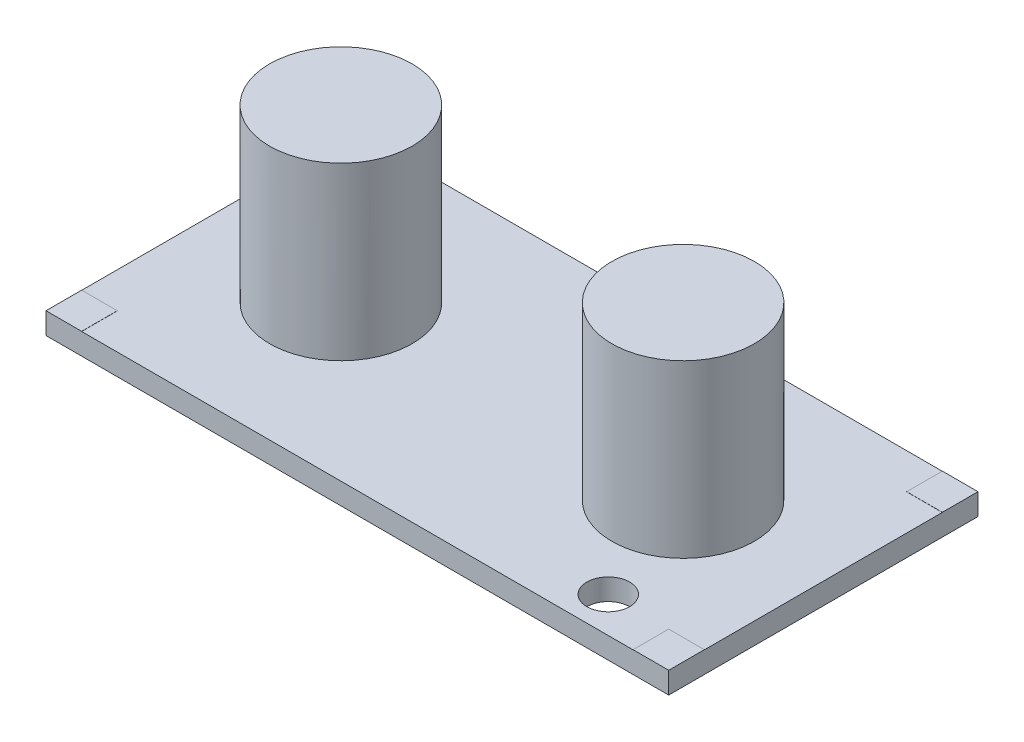
ISO-10303-21;
HEADER;
FILE_DESCRIPTION(('STEP AP214'),'2;1');
FILE_NAME('part.step','',(''),(''),'','','');
FILE_SCHEMA(('AUTOMOTIVE_DESIGN { 1 0 10303 214 1 1 1 1 }'));
ENDSEC;
DATA;
#1=APPLICATION_CONTEXT('core data for automotive mechanical design processes');
#2=APPLICATION_PROTOCOL_DEFINITION('international standard','automotive_design',2000,#1);
#3=PRODUCT_CONTEXT('',#1,'mechanical');
#4=PRODUCT('Part','Part','',(#3));
#5=PRODUCT_RELATED_PRODUCT_CATEGORY('part','',(#4));
#6=PRODUCT_DEFINITION_FORMATION('','',#4);
#7=PRODUCT_DEFINITION_CONTEXT('part definition',#1,'design');
#8=PRODUCT_DEFINITION('design','',#6,#7);
#9=PRODUCT_DEFINITION_SHAPE('','',#8);
#10=(LENGTH_UNIT() NAMED_UNIT(*) SI_UNIT(.MILLI.,.METRE.));
#11=(NAMED_UNIT(*) PLANE_ANGLE_UNIT() SI_UNIT($,.RADIAN.));
#12=(NAMED_UNIT(*) SI_UNIT($,.STERADIAN.) SOLID_ANGLE_UNIT());
#13=UNCERTAINTY_MEASURE_WITH_UNIT(LENGTH_MEASURE(1.E-05),#10,'distance_accuracy_value','');
#14=(GEOMETRIC_REPRESENTATION_CONTEXT(3) GLOBAL_UNCERTAINTY_ASSIGNED_CONTEXT((#13)) GLOBAL_UNIT_ASSIGNED_CONTEXT((#10,
#11,#12)) REPRESENTATION_CONTEXT('',''));
#15=CARTESIAN_POINT('',(0.,0.,0.));
#16=DIRECTION('',(0.,0.,1.));
#17=DIRECTION('',(1.,0.,0.));
#18=AXIS2_PLACEMENT_3D('',#15,#16,#17);
#19=CARTESIAN_POINT('',(0.,1.5,0.));
#20=DIRECTION('',(0.,-1.,0.));
#21=DIRECTION('',(0.,0.,-1.));
#22=AXIS2_PLACEMENT_3D('',#19,#20,#21);
#23=PLANE('',#22);
#24=CARTESIAN_POINT('',(12.,1.5,0.));
#25=DIRECTION('',(0.,-1.,0.));
#26=DIRECTION('',(0.,0.,-1.));
#27=AXIS2_PLACEMENT_3D('',#24,#25,#26);
#28=CIRCLE('',#27,5.);
#29=CARTESIAN_POINT('',(12.,1.5,-5.));
#30=VERTEX_POINT('',#29);
#31=EDGE_CURVE('E11',#30,#30,#28,.F.);
#32=ORIENTED_EDGE('',*,*,#31,.F.);
#33=EDGE_LOOP('',(#32));
#34=FACE_BOUND('',#33,.T.);
#35=CARTESIAN_POINT('',(-12.,1.5,0.));
#36=DIRECTION('',(0.,-1.,0.));
#37=DIRECTION('',(0.,0.,-1.));
#38=AXIS2_PLACEMENT_3D('',#35,#36,#37);
#39=CIRCLE('',#38,5.);
#40=CARTESIAN_POINT('',(-12.,1.5,-5.));
#41=VERTEX_POINT('',#40);
#42=EDGE_CURVE('E41',#41,#41,#39,.F.);
#43=ORIENTED_EDGE('',*,*,#42,.F.);
#44=EDGE_LOOP('',(#43));
#45=FACE_BOUND('',#44,.T.);
#46=CARTESIAN_POINT('',(-15.145,1.5,-8.035));
#47=DIRECTION('',(0.,1.,0.));
#48=DIRECTION('',(0.,0.,1.));
#49=AXIS2_PLACEMENT_3D('',#46,#47,#48);
#50=CIRCLE('',#49,1.5);
#51=CARTESIAN_POINT('',(-15.145,1.5,-6.535));
#52=VERTEX_POINT('',#51);
#53=EDGE_CURVE('E251',#52,#52,#50,.T.);
#54=ORIENTED_EDGE('',*,*,#53,.F.);
#55=EDGE_LOOP('',(#54));
#56=FACE_BOUND('',#55,.T.);
#57=CARTESIAN_POINT('',(15.095,1.5,8.345));
#58=DIRECTION('',(0.,1.,0.));
#59=DIRECTION('',(0.,0.,1.));
#60=AXIS2_PLACEMENT_3D('',#57,#58,#59);
#61=CIRCLE('',#60,1.5);
#62=CARTESIAN_POINT('',(15.095,1.5,9.845));
#63=VERTEX_POINT('',#62);
#64=EDGE_CURVE('E245',#63,#63,#61,.T.);
#65=ORIENTED_EDGE('',*,*,#64,.F.);
#66=EDGE_LOOP('',(#65));
#67=FACE_BOUND('',#66,.T.);
#68=DIRECTION('',(-1.,0.,0.));
#69=VECTOR('',#68,1.);
#70=CARTESIAN_POINT('',(21.835,1.5,8.345));
#71=LINE('',#70,#69);
#72=CARTESIAN_POINT('',(21.835,1.5,8.345));
#73=VERTEX_POINT('',#72);
#74=CARTESIAN_POINT('',(19.335,1.5,8.345));
#75=VERTEX_POINT('',#74);
#76=EDGE_CURVE('E52',#73,#75,#71,.T.);
#77=ORIENTED_EDGE('',*,*,#76,.F.);
#78=DIRECTION('',(0.,0.,-1.));
#79=VECTOR('',#78,1.);
#80=CARTESIAN_POINT('',(21.835,1.5,10.845));
#81=LINE('',#80,#79);
#82=CARTESIAN_POINT('',(21.835,1.5,-8.34500000000002));
#83=VERTEX_POINT('',#82);
#84=EDGE_CURVE('E166',#73,#83,#81,.T.);
#85=ORIENTED_EDGE('',*,*,#84,.T.);
#86=DIRECTION('',(1.,0.,0.));
#87=VECTOR('',#86,1.);
#88=CARTESIAN_POINT('',(21.835,1.5,-8.34500000000001));
#89=LINE('',#88,#87);
#90=CARTESIAN_POINT('',(19.335,1.5,-8.34500000000001));
#91=VERTEX_POINT('',#90);
#92=EDGE_CURVE('E170',#91,#83,#89,.T.);
#93=ORIENTED_EDGE('',*,*,#92,.F.);
#94=DIRECTION('',(0.,0.,1.));
#95=VECTOR('',#94,1.);
#96=CARTESIAN_POINT('',(19.335,1.5,-10.845));
#97=LINE('',#96,#95);
#98=CARTESIAN_POINT('',(19.335,1.5,-10.845));
#99=VERTEX_POINT('',#98);
#100=EDGE_CURVE('E167',#99,#91,#97,.T.);
#101=ORIENTED_EDGE('',*,*,#100,.F.);
#102=DIRECTION('',(-1.,0.,0.));
#103=VECTOR('',#102,1.);
#104=CARTESIAN_POINT('',(-21.835,1.5,-10.845));
#105=LINE('',#104,#103);
#106=CARTESIAN_POINT('',(-19.335,1.5,-10.845));
#107=VERTEX_POINT('',#106);
#108=EDGE_CURVE('E258',#99,#107,#105,.T.);
#109=ORIENTED_EDGE('',*,*,#108,.T.);
#110=DIRECTION('',(0.,0.,-1.));
#111=VECTOR('',#110,1.);
#112=CARTESIAN_POINT('',(-19.335,1.5,-10.845));
#113=LINE('',#112,#111);
#114=CARTESIAN_POINT('',(-19.335,1.5,-8.345));
#115=VERTEX_POINT('',#114);
#116=EDGE_CURVE('E224',#115,#107,#113,.T.);
#117=ORIENTED_EDGE('',*,*,#116,.F.);
#118=DIRECTION('',(1.,0.,0.));
#119=VECTOR('',#118,1.);
#120=CARTESIAN_POINT('',(-21.835,1.5,-8.345));
#121=LINE('',#120,#119);
#122=CARTESIAN_POINT('',(-21.835,1.5,-8.345));
#123=VERTEX_POINT('',#122);
#124=EDGE_CURVE('E219',#123,#115,#121,.T.);
#125=ORIENTED_EDGE('',*,*,#124,.F.);
#126=DIRECTION('',(0.,0.,1.));
#127=VECTOR('',#126,1.);
#128=CARTESIAN_POINT('',(-21.835,1.5,10.845));
#129=LINE('',#128,#127);
#130=CARTESIAN_POINT('',(-21.835,1.5,8.345));
#131=VERTEX_POINT('',#130);
#132=EDGE_CURVE('E261',#123,#131,#129,.T.);
#133=ORIENTED_EDGE('',*,*,#132,.T.);
#134=DIRECTION('',(-1.,0.,0.));
#135=VECTOR('',#134,1.);
#136=CARTESIAN_POINT('',(-21.835,1.5,8.345));
#137=LINE('',#136,#135);
#138=CARTESIAN_POINT('',(-19.335,1.5,8.345));
#139=VERTEX_POINT('',#138);
#140=EDGE_CURVE('E200',#139,#131,#137,.T.);
#141=ORIENTED_EDGE('',*,*,#140,.F.);
#142=DIRECTION('',(0.,0.,-1.));
#143=VECTOR('',#142,1.);
#144=CARTESIAN_POINT('',(-19.335,1.5,10.845));
#145=LINE('',#144,#143);
#146=CARTESIAN_POINT('',(-19.335,1.5,10.845));
#147=VERTEX_POINT('',#146);
#148=EDGE_CURVE('E195',#147,#139,#145,.T.);
#149=ORIENTED_EDGE('',*,*,#148,.F.);
#150=DIRECTION('',(1.,0.,0.));
#151=VECTOR('',#150,1.);
#152=CARTESIAN_POINT('',(-21.835,1.5,10.845));
#153=LINE('',#152,#151);
#154=CARTESIAN_POINT('',(19.335,1.5,10.845));
#155=VERTEX_POINT('',#154);
#156=EDGE_CURVE('E263',#147,#155,#153,.T.);
#157=ORIENTED_EDGE('',*,*,#156,.T.);
#158=DIRECTION('',(0.,0.,1.));
#159=VECTOR('',#158,1.);
#160=CARTESIAN_POINT('',(19.335,1.5,10.845));
#161=LINE('',#160,#159);
#162=EDGE_CURVE('E48',#75,#155,#161,.T.);
#163=ORIENTED_EDGE('',*,*,#162,.F.);
#164=EDGE_LOOP('',(#77,#85,#93,#101,#109,#117,#125,#133,#141,#149,#157,#163));
#165=FACE_BOUND('',#164,.T.);
#166=ADVANCED_FACE('F33',(#34,#45,#56,#67,#165),#23,.F.);
#167=CARTESIAN_POINT('',(0.,0.,0.));
#168=DIRECTION('',(0.,-1.,0.));
#169=DIRECTION('',(0.,0.,-1.));
#170=AXIS2_PLACEMENT_3D('',#167,#168,#169);
#171=PLANE('',#170);
#172=CARTESIAN_POINT('',(-15.145,0.,-8.035));
#173=DIRECTION('',(0.,1.,0.));
#174=DIRECTION('',(0.,0.,1.));
#175=AXIS2_PLACEMENT_3D('',#172,#173,#174);
#176=CIRCLE('',#175,1.5);
#177=CARTESIAN_POINT('',(-15.145,0.,-6.535));
#178=VERTEX_POINT('',#177);
#179=EDGE_CURVE('E248',#178,#178,#176,.T.);
#180=ORIENTED_EDGE('',*,*,#179,.T.);
#181=EDGE_LOOP('',(#180));
#182=FACE_BOUND('',#181,.T.);
#183=DIRECTION('',(0.,0.,-1.));
#184=VECTOR('',#183,1.);
#185=CARTESIAN_POINT('',(21.835,0.,10.845));
#186=LINE('',#185,#184);
#187=CARTESIAN_POINT('',(21.835,0.,10.845));
#188=VERTEX_POINT('',#187);
#189=CARTESIAN_POINT('',(21.835,0.,-10.845));
#190=VERTEX_POINT('',#189);
#191=EDGE_CURVE('E254',#188,#190,#186,.T.);
#192=ORIENTED_EDGE('',*,*,#191,.F.);
#193=DIRECTION('',(1.,0.,0.));
#194=VECTOR('',#193,1.);
#195=CARTESIAN_POINT('',(-21.835,0.,10.845));
#196=LINE('',#195,#194);
#197=CARTESIAN_POINT('',(-21.835,0.,10.845));
#198=VERTEX_POINT('',#197);
#199=EDGE_CURVE('E259',#198,#188,#196,.T.);
#200=ORIENTED_EDGE('',*,*,#199,.F.);
#201=DIRECTION('',(0.,0.,1.));
#202=VECTOR('',#201,1.);
#203=CARTESIAN_POINT('',(-21.835,0.,10.845));
#204=LINE('',#203,#202);
#205=CARTESIAN_POINT('',(-21.835,0.,-10.845));
#206=VERTEX_POINT('',#205);
#207=EDGE_CURVE('E269',#206,#198,#204,.T.);
#208=ORIENTED_EDGE('',*,*,#207,.F.);
#209=DIRECTION('',(-1.,0.,0.));
#210=VECTOR('',#209,1.);
#211=CARTESIAN_POINT('',(-21.835,0.,-10.845));
#212=LINE('',#211,#210);
#213=EDGE_CURVE('E267',#190,#206,#212,.T.);
#214=ORIENTED_EDGE('',*,*,#213,.F.);
#215=EDGE_LOOP('',(#192,#200,#208,#214));
#216=FACE_BOUND('',#215,.T.);
#217=CARTESIAN_POINT('',(15.095,0.,8.345));
#218=DIRECTION('',(0.,1.,0.));
#219=DIRECTION('',(0.,0.,1.));
#220=AXIS2_PLACEMENT_3D('',#217,#218,#219);
#221=CIRCLE('',#220,1.5);
#222=CARTESIAN_POINT('',(15.095,0.,9.845));
#223=VERTEX_POINT('',#222);
#224=EDGE_CURVE('E244',#223,#223,#221,.T.);
#225=ORIENTED_EDGE('',*,*,#224,.T.);
#226=EDGE_LOOP('',(#225));
#227=FACE_BOUND('',#226,.T.);
#228=ADVANCED_FACE('F288',(#182,#216,#227),#171,.T.);
#229=CARTESIAN_POINT('',(21.835,1.5,10.845));
#230=DIRECTION('',(-1.,0.,0.));
#231=DIRECTION('',(0.,0.,1.));
#232=AXIS2_PLACEMENT_3D('',#229,#230,#231);
#233=PLANE('',#232);
#234=ORIENTED_EDGE('',*,*,#191,.T.);
#235=DIRECTION('',(0.,-1.,0.));
#236=VECTOR('',#235,1.);
#237=CARTESIAN_POINT('',(21.835,1.5,-10.845));
#238=LINE('',#237,#236);
#239=CARTESIAN_POINT('',(21.835,1.51,-10.845));
#240=VERTEX_POINT('',#239);
#241=EDGE_CURVE('E279',#240,#190,#238,.T.);
#242=ORIENTED_EDGE('',*,*,#241,.F.);
#243=DIRECTION('',(0.,0.,-1.));
#244=VECTOR('',#243,1.);
#245=CARTESIAN_POINT('',(21.835,1.51,-10.845));
#246=LINE('',#245,#244);
#247=CARTESIAN_POINT('',(21.835,1.51,-8.34500000000001));
#248=VERTEX_POINT('',#247);
#249=EDGE_CURVE('E176',#248,#240,#246,.T.);
#250=ORIENTED_EDGE('',*,*,#249,.F.);
#251=DIRECTION('',(0.,-1.,0.));
#252=VECTOR('',#251,1.);
#253=CARTESIAN_POINT('',(21.835,1.51,-8.34500000000001));
#254=LINE('',#253,#252);
#255=EDGE_CURVE('E184',#248,#83,#254,.T.);
#256=ORIENTED_EDGE('',*,*,#255,.T.);
#257=ORIENTED_EDGE('',*,*,#84,.F.);
#258=DIRECTION('',(0.,-1.,0.));
#259=VECTOR('',#258,1.);
#260=CARTESIAN_POINT('',(21.835,1.51,8.345));
#261=LINE('',#260,#259);
#262=CARTESIAN_POINT('',(21.835,1.51,8.345));
#263=VERTEX_POINT('',#262);
#264=EDGE_CURVE('E148',#263,#73,#261,.T.);
#265=ORIENTED_EDGE('',*,*,#264,.F.);
#266=DIRECTION('',(0.,0.,-1.));
#267=VECTOR('',#266,1.);
#268=CARTESIAN_POINT('',(21.835,1.51,10.845));
#269=LINE('',#268,#267);
#270=CARTESIAN_POINT('',(21.835,1.51,10.845));
#271=VERTEX_POINT('',#270);
#272=EDGE_CURVE('E154',#271,#263,#269,.T.);
#273=ORIENTED_EDGE('',*,*,#272,.F.);
#274=DIRECTION('',(0.,-1.,0.));
#275=VECTOR('',#274,1.);
#276=CARTESIAN_POINT('',(21.835,1.5,10.845));
#277=LINE('',#276,#275);
#278=EDGE_CURVE('E265',#271,#188,#277,.T.);
#279=ORIENTED_EDGE('',*,*,#278,.T.);
#280=EDGE_LOOP('',(#234,#242,#250,#256,#257,#265,#273,#279));
#281=FACE_BOUND('',#280,.T.);
#282=ADVANCED_FACE('F35',(#281),#233,.F.);
#283=CARTESIAN_POINT('',(-21.835,1.5,-10.845));
#284=DIRECTION('',(0.,0.,1.));
#285=DIRECTION('',(1.,0.,0.));
#286=AXIS2_PLACEMENT_3D('',#283,#284,#285);
#287=PLANE('',#286);
#288=ORIENTED_EDGE('',*,*,#213,.T.);
#289=DIRECTION('',(0.,-1.,0.));
#290=VECTOR('',#289,1.);
#291=CARTESIAN_POINT('',(-21.835,1.5,-10.845));
#292=LINE('',#291,#290);
#293=CARTESIAN_POINT('',(-21.835,1.51,-10.845));
#294=VERTEX_POINT('',#293);
#295=EDGE_CURVE('E276',#294,#206,#292,.T.);
#296=ORIENTED_EDGE('',*,*,#295,.F.);
#297=DIRECTION('',(-1.,0.,0.));
#298=VECTOR('',#297,1.);
#299=CARTESIAN_POINT('',(-21.835,1.51,-10.845));
#300=LINE('',#299,#298);
#301=CARTESIAN_POINT('',(-19.335,1.51,-10.845));
#302=VERTEX_POINT('',#301);
#303=EDGE_CURVE('E228',#302,#294,#300,.T.);
#304=ORIENTED_EDGE('',*,*,#303,.F.);
#305=DIRECTION('',(0.,-1.,0.));
#306=VECTOR('',#305,1.);
#307=CARTESIAN_POINT('',(-19.335,1.51,-10.845));
#308=LINE('',#307,#306);
#309=EDGE_CURVE('E231',#302,#107,#308,.T.);
#310=ORIENTED_EDGE('',*,*,#309,.T.);
#311=ORIENTED_EDGE('',*,*,#108,.F.);
#312=DIRECTION('',(0.,-1.,0.));
#313=VECTOR('',#312,1.);
#314=CARTESIAN_POINT('',(19.335,1.51,-10.845));
#315=LINE('',#314,#313);
#316=CARTESIAN_POINT('',(19.335,1.51,-10.845));
#317=VERTEX_POINT('',#316);
#318=EDGE_CURVE('E192',#317,#99,#315,.T.);
#319=ORIENTED_EDGE('',*,*,#318,.F.);
#320=DIRECTION('',(-1.,0.,0.));
#321=VECTOR('',#320,1.);
#322=CARTESIAN_POINT('',(21.835,1.51,-10.845));
#323=LINE('',#322,#321);
#324=EDGE_CURVE('E179',#240,#317,#323,.T.);
#325=ORIENTED_EDGE('',*,*,#324,.F.);
#326=ORIENTED_EDGE('',*,*,#241,.T.);
#327=EDGE_LOOP('',(#288,#296,#304,#310,#311,#319,#325,#326));
#328=FACE_BOUND('',#327,.T.);
#329=ADVANCED_FACE('F309',(#328),#287,.F.);
#330=CARTESIAN_POINT('',(-21.835,1.5,10.845));
#331=DIRECTION('',(1.,0.,0.));
#332=DIRECTION('',(0.,0.,-1.));
#333=AXIS2_PLACEMENT_3D('',#330,#331,#332);
#334=PLANE('',#333);
#335=ORIENTED_EDGE('',*,*,#207,.T.);
#336=DIRECTION('',(0.,-1.,0.));
#337=VECTOR('',#336,1.);
#338=CARTESIAN_POINT('',(-21.835,1.5,10.845));
#339=LINE('',#338,#337);
#340=CARTESIAN_POINT('',(-21.835,1.51,10.845));
#341=VERTEX_POINT('',#340);
#342=EDGE_CURVE('E273',#341,#198,#339,.T.);
#343=ORIENTED_EDGE('',*,*,#342,.F.);
#344=DIRECTION('',(0.,0.,1.));
#345=VECTOR('',#344,1.);
#346=CARTESIAN_POINT('',(-21.835,1.51,10.845));
#347=LINE('',#346,#345);
#348=CARTESIAN_POINT('',(-21.835,1.51,8.345));
#349=VERTEX_POINT('',#348);
#350=EDGE_CURVE('E196',#349,#341,#347,.T.);
#351=ORIENTED_EDGE('',*,*,#350,.F.);
#352=DIRECTION('',(0.,-1.,0.));
#353=VECTOR('',#352,1.);
#354=CARTESIAN_POINT('',(-21.835,1.51,8.345));
#355=LINE('',#354,#353);
#356=EDGE_CURVE('E206',#349,#131,#355,.T.);
#357=ORIENTED_EDGE('',*,*,#356,.T.);
#358=ORIENTED_EDGE('',*,*,#132,.F.);
#359=DIRECTION('',(0.,-1.,0.));
#360=VECTOR('',#359,1.);
#361=CARTESIAN_POINT('',(-21.835,1.51,-8.345));
#362=LINE('',#361,#360);
#363=CARTESIAN_POINT('',(-21.835,1.51,-8.345));
#364=VERTEX_POINT('',#363);
#365=EDGE_CURVE('E241',#364,#123,#362,.T.);
#366=ORIENTED_EDGE('',*,*,#365,.F.);
#367=DIRECTION('',(0.,0.,1.));
#368=VECTOR('',#367,1.);
#369=CARTESIAN_POINT('',(-21.835,1.51,-10.845));
#370=LINE('',#369,#368);
#371=EDGE_CURVE('E220',#294,#364,#370,.T.);
#372=ORIENTED_EDGE('',*,*,#371,.F.);
#373=ORIENTED_EDGE('',*,*,#295,.T.);
#374=EDGE_LOOP('',(#335,#343,#351,#357,#358,#366,#372,#373));
#375=FACE_BOUND('',#374,.T.);
#376=ADVANCED_FACE('F316',(#375),#334,.F.);
#377=CARTESIAN_POINT('',(-21.835,1.5,10.845));
#378=DIRECTION('',(0.,0.,-1.));
#379=DIRECTION('',(-1.,0.,0.));
#380=AXIS2_PLACEMENT_3D('',#377,#378,#379);
#381=PLANE('',#380);
#382=ORIENTED_EDGE('',*,*,#199,.T.);
#383=ORIENTED_EDGE('',*,*,#278,.F.);
#384=DIRECTION('',(1.,0.,0.));
#385=VECTOR('',#384,1.);
#386=CARTESIAN_POINT('',(21.835,1.51,10.845));
#387=LINE('',#386,#385);
#388=CARTESIAN_POINT('',(19.335,1.51,10.845));
#389=VERTEX_POINT('',#388);
#390=EDGE_CURVE('E160',#389,#271,#387,.T.);
#391=ORIENTED_EDGE('',*,*,#390,.F.);
#392=DIRECTION('',(0.,-1.,0.));
#393=VECTOR('',#392,1.);
#394=CARTESIAN_POINT('',(19.335,1.51,10.845));
#395=LINE('',#394,#393);
#396=EDGE_CURVE('E172',#389,#155,#395,.T.);
#397=ORIENTED_EDGE('',*,*,#396,.T.);
#398=ORIENTED_EDGE('',*,*,#156,.F.);
#399=DIRECTION('',(0.,-1.,0.));
#400=VECTOR('',#399,1.);
#401=CARTESIAN_POINT('',(-19.335,1.51,10.845));
#402=LINE('',#401,#400);
#403=CARTESIAN_POINT('',(-19.335,1.51,10.845));
#404=VERTEX_POINT('',#403);
#405=EDGE_CURVE('E216',#404,#147,#402,.T.);
#406=ORIENTED_EDGE('',*,*,#405,.F.);
#407=DIRECTION('',(1.,0.,0.));
#408=VECTOR('',#407,1.);
#409=CARTESIAN_POINT('',(-21.835,1.51,10.845));
#410=LINE('',#409,#408);
#411=EDGE_CURVE('E199',#341,#404,#410,.T.);
#412=ORIENTED_EDGE('',*,*,#411,.F.);
#413=ORIENTED_EDGE('',*,*,#342,.T.);
#414=EDGE_LOOP('',(#382,#383,#391,#397,#398,#406,#412,#413));
#415=FACE_BOUND('',#414,.T.);
#416=ADVANCED_FACE('F313',(#415),#381,.F.);
#417=CARTESIAN_POINT('',(-15.145,1.5,-8.035));
#418=DIRECTION('',(0.,-1.,0.));
#419=DIRECTION('',(0.,0.,-1.));
#420=AXIS2_PLACEMENT_3D('',#417,#418,#419);
#421=CYLINDRICAL_SURFACE('',#420,1.5);
#422=ORIENTED_EDGE('',*,*,#53,.T.);
#423=EDGE_LOOP('',(#422));
#424=FACE_BOUND('',#423,.T.);
#425=ORIENTED_EDGE('',*,*,#179,.F.);
#426=EDGE_LOOP('',(#425));
#427=FACE_BOUND('',#426,.T.);
#428=ADVANCED_FACE('F299',(#424,#427),#421,.F.);
#429=CARTESIAN_POINT('',(15.095,1.5,8.345));
#430=DIRECTION('',(0.,-1.,0.));
#431=DIRECTION('',(0.,0.,-1.));
#432=AXIS2_PLACEMENT_3D('',#429,#430,#431);
#433=CYLINDRICAL_SURFACE('',#432,1.5);
#434=ORIENTED_EDGE('',*,*,#64,.T.);
#435=EDGE_LOOP('',(#434));
#436=FACE_BOUND('',#435,.T.);
#437=ORIENTED_EDGE('',*,*,#224,.F.);
#438=EDGE_LOOP('',(#437));
#439=FACE_BOUND('',#438,.T.);
#440=ADVANCED_FACE('F295',(#436,#439),#433,.F.);
#441=CARTESIAN_POINT('',(-21.835,1.51,-8.345));
#442=DIRECTION('',(0.,0.,-1.));
#443=DIRECTION('',(-1.,0.,0.));
#444=AXIS2_PLACEMENT_3D('',#441,#442,#443);
#445=PLANE('',#444);
#446=ORIENTED_EDGE('',*,*,#124,.T.);
#447=DIRECTION('',(0.,-1.,0.));
#448=VECTOR('',#447,1.);
#449=CARTESIAN_POINT('',(-19.335,1.51,-8.345));
#450=LINE('',#449,#448);
#451=CARTESIAN_POINT('',(-19.335,1.51,-8.345));
#452=VERTEX_POINT('',#451);
#453=EDGE_CURVE('E238',#452,#115,#450,.T.);
#454=ORIENTED_EDGE('',*,*,#453,.F.);
#455=DIRECTION('',(1.,0.,0.));
#456=VECTOR('',#455,1.);
#457=CARTESIAN_POINT('',(-21.835,1.51,-8.345));
#458=LINE('',#457,#456);
#459=EDGE_CURVE('E223',#364,#452,#458,.T.);
#460=ORIENTED_EDGE('',*,*,#459,.F.);
#461=ORIENTED_EDGE('',*,*,#365,.T.);
#462=EDGE_LOOP('',(#446,#454,#460,#461));
#463=FACE_BOUND('',#462,.T.);
#464=ADVANCED_FACE('F298',(#463),#445,.F.);
#465=CARTESIAN_POINT('',(-19.335,1.51,-10.845));
#466=DIRECTION('',(-1.,0.,0.));
#467=DIRECTION('',(0.,0.,1.));
#468=AXIS2_PLACEMENT_3D('',#465,#466,#467);
#469=PLANE('',#468);
#470=ORIENTED_EDGE('',*,*,#116,.T.);
#471=ORIENTED_EDGE('',*,*,#309,.F.);
#472=DIRECTION('',(0.,0.,-1.));
#473=VECTOR('',#472,1.);
#474=CARTESIAN_POINT('',(-19.335,1.51,-10.845));
#475=LINE('',#474,#473);
#476=EDGE_CURVE('E226',#452,#302,#475,.T.);
#477=ORIENTED_EDGE('',*,*,#476,.F.);
#478=ORIENTED_EDGE('',*,*,#453,.T.);
#479=EDGE_LOOP('',(#470,#471,#477,#478));
#480=FACE_BOUND('',#479,.T.);
#481=ADVANCED_FACE('F368',(#480),#469,.F.);
#482=CARTESIAN_POINT('',(0.,1.51,0.));
#483=DIRECTION('',(0.,1.,0.));
#484=DIRECTION('',(0.,0.,1.));
#485=AXIS2_PLACEMENT_3D('',#482,#483,#484);
#486=PLANE('',#485);
#487=ORIENTED_EDGE('',*,*,#371,.T.);
#488=ORIENTED_EDGE('',*,*,#459,.T.);
#489=ORIENTED_EDGE('',*,*,#476,.T.);
#490=ORIENTED_EDGE('',*,*,#303,.T.);
#491=EDGE_LOOP('',(#487,#488,#489,#490));
#492=FACE_BOUND('',#491,.T.);
#493=ADVANCED_FACE('F364',(#492),#486,.T.);
#494=CARTESIAN_POINT('',(-19.335,1.51,10.845));
#495=DIRECTION('',(-1.,0.,0.));
#496=DIRECTION('',(0.,0.,1.));
#497=AXIS2_PLACEMENT_3D('',#494,#495,#496);
#498=PLANE('',#497);
#499=ORIENTED_EDGE('',*,*,#148,.T.);
#500=DIRECTION('',(0.,-1.,0.));
#501=VECTOR('',#500,1.);
#502=CARTESIAN_POINT('',(-19.335,1.51,8.345));
#503=LINE('',#502,#501);
#504=CARTESIAN_POINT('',(-19.335,1.51,8.345));
#505=VERTEX_POINT('',#504);
#506=EDGE_CURVE('E213',#505,#139,#503,.T.);
#507=ORIENTED_EDGE('',*,*,#506,.F.);
#508=DIRECTION('',(0.,0.,-1.));
#509=VECTOR('',#508,1.);
#510=CARTESIAN_POINT('',(-19.335,1.51,10.845));
#511=LINE('',#510,#509);
#512=EDGE_CURVE('E202',#404,#505,#511,.T.);
#513=ORIENTED_EDGE('',*,*,#512,.F.);
#514=ORIENTED_EDGE('',*,*,#405,.T.);
#515=EDGE_LOOP('',(#499,#507,#513,#514));
#516=FACE_BOUND('',#515,.T.);
#517=ADVANCED_FACE('F360',(#516),#498,.F.);
#518=CARTESIAN_POINT('',(-21.835,1.51,8.345));
#519=DIRECTION('',(0.,0.,1.));
#520=DIRECTION('',(1.,0.,0.));
#521=AXIS2_PLACEMENT_3D('',#518,#519,#520);
#522=PLANE('',#521);
#523=ORIENTED_EDGE('',*,*,#140,.T.);
#524=ORIENTED_EDGE('',*,*,#356,.F.);
#525=DIRECTION('',(-1.,0.,0.));
#526=VECTOR('',#525,1.);
#527=CARTESIAN_POINT('',(-21.835,1.51,8.345));
#528=LINE('',#527,#526);
#529=EDGE_CURVE('E204',#505,#349,#528,.T.);
#530=ORIENTED_EDGE('',*,*,#529,.F.);
#531=ORIENTED_EDGE('',*,*,#506,.T.);
#532=EDGE_LOOP('',(#523,#524,#530,#531));
#533=FACE_BOUND('',#532,.T.);
#534=ADVANCED_FACE('F353',(#533),#522,.F.);
#535=CARTESIAN_POINT('',(0.,1.51,0.));
#536=DIRECTION('',(0.,-1.,0.));
#537=DIRECTION('',(0.,0.,-1.));
#538=AXIS2_PLACEMENT_3D('',#535,#536,#537);
#539=PLANE('',#538);
#540=ORIENTED_EDGE('',*,*,#350,.T.);
#541=ORIENTED_EDGE('',*,*,#411,.T.);
#542=ORIENTED_EDGE('',*,*,#512,.T.);
#543=ORIENTED_EDGE('',*,*,#529,.T.);
#544=EDGE_LOOP('',(#540,#541,#542,#543));
#545=FACE_BOUND('',#544,.T.);
#546=ADVANCED_FACE('F346',(#545),#539,.F.);
#547=CARTESIAN_POINT('',(19.335,1.51,-10.845));
#548=DIRECTION('',(1.,0.,0.));
#549=DIRECTION('',(0.,0.,-1.));
#550=AXIS2_PLACEMENT_3D('',#547,#548,#549);
#551=PLANE('',#550);
#552=ORIENTED_EDGE('',*,*,#100,.T.);
#553=DIRECTION('',(0.,-1.,0.));
#554=VECTOR('',#553,1.);
#555=CARTESIAN_POINT('',(19.335,1.51,-8.34500000000001));
#556=LINE('',#555,#554);
#557=CARTESIAN_POINT('',(19.335,1.51,-8.34500000000001));
#558=VERTEX_POINT('',#557);
#559=EDGE_CURVE('E189',#558,#91,#556,.T.);
#560=ORIENTED_EDGE('',*,*,#559,.F.);
#561=DIRECTION('',(0.,0.,1.));
#562=VECTOR('',#561,1.);
#563=CARTESIAN_POINT('',(19.335,1.51,-10.845));
#564=LINE('',#563,#562);
#565=EDGE_CURVE('E181',#317,#558,#564,.T.);
#566=ORIENTED_EDGE('',*,*,#565,.F.);
#567=ORIENTED_EDGE('',*,*,#318,.T.);
#568=EDGE_LOOP('',(#552,#560,#566,#567));
#569=FACE_BOUND('',#568,.T.);
#570=ADVANCED_FACE('F344',(#569),#551,.F.);
#571=CARTESIAN_POINT('',(21.835,1.51,-8.34500000000001));
#572=DIRECTION('',(0.,0.,-1.));
#573=DIRECTION('',(-1.,0.,0.));
#574=AXIS2_PLACEMENT_3D('',#571,#572,#573);
#575=PLANE('',#574);
#576=ORIENTED_EDGE('',*,*,#92,.T.);
#577=ORIENTED_EDGE('',*,*,#255,.F.);
#578=DIRECTION('',(1.,0.,0.));
#579=VECTOR('',#578,1.);
#580=CARTESIAN_POINT('',(21.835,1.51,-8.34500000000001));
#581=LINE('',#580,#579);
#582=EDGE_CURVE('E183',#558,#248,#581,.T.);
#583=ORIENTED_EDGE('',*,*,#582,.F.);
#584=ORIENTED_EDGE('',*,*,#559,.T.);
#585=EDGE_LOOP('',(#576,#577,#583,#584));
#586=FACE_BOUND('',#585,.T.);
#587=ADVANCED_FACE('F341',(#586),#575,.F.);
#588=CARTESIAN_POINT('',(0.,1.51,0.));
#589=DIRECTION('',(0.,-1.,0.));
#590=DIRECTION('',(0.,0.,-1.));
#591=AXIS2_PLACEMENT_3D('',#588,#589,#590);
#592=PLANE('',#591);
#593=ORIENTED_EDGE('',*,*,#249,.T.);
#594=ORIENTED_EDGE('',*,*,#324,.T.);
#595=ORIENTED_EDGE('',*,*,#565,.T.);
#596=ORIENTED_EDGE('',*,*,#582,.T.);
#597=EDGE_LOOP('',(#593,#594,#595,#596));
#598=FACE_BOUND('',#597,.T.);
#599=ADVANCED_FACE('F336',(#598),#592,.F.);
#600=CARTESIAN_POINT('',(21.835,1.51,8.345));
#601=DIRECTION('',(0.,0.,1.));
#602=DIRECTION('',(1.,0.,0.));
#603=AXIS2_PLACEMENT_3D('',#600,#601,#602);
#604=PLANE('',#603);
#605=ORIENTED_EDGE('',*,*,#76,.T.);
#606=DIRECTION('',(0.,-1.,0.));
#607=VECTOR('',#606,1.);
#608=CARTESIAN_POINT('',(19.335,1.51,8.345));
#609=LINE('',#608,#607);
#610=CARTESIAN_POINT('',(19.335,1.51,8.345));
#611=VERTEX_POINT('',#610);
#612=EDGE_CURVE('E150',#611,#75,#609,.T.);
#613=ORIENTED_EDGE('',*,*,#612,.F.);
#614=DIRECTION('',(-1.,0.,0.));
#615=VECTOR('',#614,1.);
#616=CARTESIAN_POINT('',(21.835,1.51,8.345));
#617=LINE('',#616,#615);
#618=EDGE_CURVE('E144',#263,#611,#617,.T.);
#619=ORIENTED_EDGE('',*,*,#618,.F.);
#620=ORIENTED_EDGE('',*,*,#264,.T.);
#621=EDGE_LOOP('',(#605,#613,#619,#620));
#622=FACE_BOUND('',#621,.T.);
#623=ADVANCED_FACE('F146',(#622),#604,.F.);
#624=CARTESIAN_POINT('',(19.335,1.51,10.845));
#625=DIRECTION('',(1.,0.,0.));
#626=DIRECTION('',(0.,0.,-1.));
#627=AXIS2_PLACEMENT_3D('',#624,#625,#626);
#628=PLANE('',#627);
#629=ORIENTED_EDGE('',*,*,#162,.T.);
#630=ORIENTED_EDGE('',*,*,#396,.F.);
#631=DIRECTION('',(0.,0.,1.));
#632=VECTOR('',#631,1.);
#633=CARTESIAN_POINT('',(19.335,1.51,10.845));
#634=LINE('',#633,#632);
#635=EDGE_CURVE('E153',#611,#389,#634,.T.);
#636=ORIENTED_EDGE('',*,*,#635,.F.);
#637=ORIENTED_EDGE('',*,*,#612,.T.);
#638=EDGE_LOOP('',(#629,#630,#636,#637));
#639=FACE_BOUND('',#638,.T.);
#640=ADVANCED_FACE('F456',(#639),#628,.F.);
#641=CARTESIAN_POINT('',(0.,1.51,0.));
#642=DIRECTION('',(0.,1.,0.));
#643=DIRECTION('',(0.,0.,1.));
#644=AXIS2_PLACEMENT_3D('',#641,#642,#643);
#645=PLANE('',#644);
#646=ORIENTED_EDGE('',*,*,#272,.T.);
#647=ORIENTED_EDGE('',*,*,#618,.T.);
#648=ORIENTED_EDGE('',*,*,#635,.T.);
#649=ORIENTED_EDGE('',*,*,#390,.T.);
#650=EDGE_LOOP('',(#646,#647,#648,#649));
#651=FACE_BOUND('',#650,.T.);
#652=ADVANCED_FACE('F158',(#651),#645,.T.);
#653=CARTESIAN_POINT('',(-12.,13.5,0.));
#654=DIRECTION('',(0.,-1.,0.));
#655=DIRECTION('',(0.,0.,-1.));
#656=AXIS2_PLACEMENT_3D('',#653,#654,#655);
#657=CYLINDRICAL_SURFACE('',#656,5.);
#658=CARTESIAN_POINT('',(-12.,13.5,0.));
#659=DIRECTION('',(0.,1.,0.));
#660=DIRECTION('',(0.,0.,1.));
#661=AXIS2_PLACEMENT_3D('',#658,#659,#660);
#662=CIRCLE('',#661,5.);
#663=CARTESIAN_POINT('',(-12.,13.5,5.));
#664=VERTEX_POINT('',#663);
#665=EDGE_CURVE('E524',#664,#664,#662,.T.);
#666=ORIENTED_EDGE('',*,*,#665,.F.);
#667=EDGE_LOOP('',(#666));
#668=FACE_BOUND('',#667,.T.);
#669=ORIENTED_EDGE('',*,*,#42,.T.);
#670=EDGE_LOOP('',(#669));
#671=FACE_BOUND('',#670,.T.);
#672=ADVANCED_FACE('F284',(#668,#671),#657,.T.);
#673=CARTESIAN_POINT('',(-12.,13.5,0.));
#674=DIRECTION('',(0.,1.,0.));
#675=DIRECTION('',(0.,0.,1.));
#676=AXIS2_PLACEMENT_3D('',#673,#674,#675);
#677=PLANE('',#676);
#678=ORIENTED_EDGE('',*,*,#665,.T.);
#679=EDGE_LOOP('',(#678));
#680=FACE_BOUND('',#679,.T.);
#681=ADVANCED_FACE('F487',(#680),#677,.T.);
#682=CARTESIAN_POINT('',(12.,13.5,0.));
#683=DIRECTION('',(0.,-1.,0.));
#684=DIRECTION('',(0.,0.,-1.));
#685=AXIS2_PLACEMENT_3D('',#682,#683,#684);
#686=CYLINDRICAL_SURFACE('',#685,5.);
#687=CARTESIAN_POINT('',(12.,13.5,0.));
#688=DIRECTION('',(0.,1.,0.));
#689=DIRECTION('',(0.,0.,-1.));
#690=AXIS2_PLACEMENT_3D('',#687,#688,#689);
#691=CIRCLE('',#690,5.);
#692=CARTESIAN_POINT('',(12.,13.5,-5.));
#693=VERTEX_POINT('',#692);
#694=EDGE_CURVE('E523',#693,#693,#691,.T.);
#695=ORIENTED_EDGE('',*,*,#694,.F.);
#696=EDGE_LOOP('',(#695));
#697=FACE_BOUND('',#696,.T.);
#698=ORIENTED_EDGE('',*,*,#31,.T.);
#699=EDGE_LOOP('',(#698));
#700=FACE_BOUND('',#699,.T.);
#701=ADVANCED_FACE('F497',(#697,#700),#686,.T.);
#702=CARTESIAN_POINT('',(12.,13.5,0.));
#703=DIRECTION('',(0.,-1.,0.));
#704=DIRECTION('',(0.,0.,-1.));
#705=AXIS2_PLACEMENT_3D('',#702,#703,#704);
#706=PLANE('',#705);
#707=ORIENTED_EDGE('',*,*,#694,.T.);
#708=EDGE_LOOP('',(#707));
#709=FACE_BOUND('',#708,.T.);
#710=ADVANCED_FACE('F507',(#709),#706,.F.);
#711=CLOSED_SHELL('',(#166,#228,#282,#329,#376,#416,#428,#440,#464,#481,#493,#517,#534,#546,
#570,#587,#599,#623,#640,#652,#672,#681,#701,#710));
#712=MANIFOLD_SOLID_BREP('B2',#711);
#713=ADVANCED_BREP_SHAPE_REPRESENTATION('',(#18,#712),#14);
#714=SHAPE_DEFINITION_REPRESENTATION(#9,#713);
ENDSEC;
END-ISO-10303-21;
